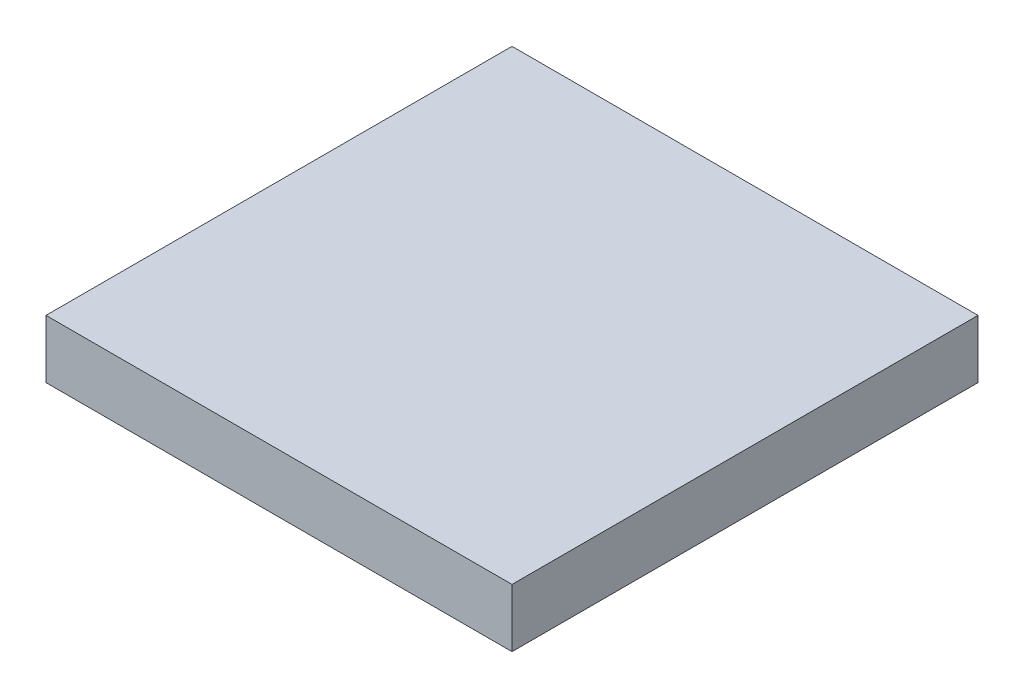
ISO-10303-21;
HEADER;
FILE_DESCRIPTION(('STEP AP214'),'2;1');
FILE_NAME('part.step','',(''),(''),'','','');
FILE_SCHEMA(('AUTOMOTIVE_DESIGN { 1 0 10303 214 1 1 1 1 }'));
ENDSEC;
DATA;
#1=APPLICATION_CONTEXT('core data for automotive mechanical design processes');
#2=APPLICATION_PROTOCOL_DEFINITION('international standard','automotive_design',2000,#1);
#3=PRODUCT_CONTEXT('',#1,'mechanical');
#4=PRODUCT('Part','Part','',(#3));
#5=PRODUCT_RELATED_PRODUCT_CATEGORY('part','',(#4));
#6=PRODUCT_DEFINITION_FORMATION('','',#4);
#7=PRODUCT_DEFINITION_CONTEXT('part definition',#1,'design');
#8=PRODUCT_DEFINITION('design','',#6,#7);
#9=PRODUCT_DEFINITION_SHAPE('','',#8);
#10=(LENGTH_UNIT() NAMED_UNIT(*) SI_UNIT(.MILLI.,.METRE.));
#11=(NAMED_UNIT(*) PLANE_ANGLE_UNIT() SI_UNIT($,.RADIAN.));
#12=(NAMED_UNIT(*) SI_UNIT($,.STERADIAN.) SOLID_ANGLE_UNIT());
#13=UNCERTAINTY_MEASURE_WITH_UNIT(LENGTH_MEASURE(1.E-05),#10,'distance_accuracy_value','');
#14=(GEOMETRIC_REPRESENTATION_CONTEXT(3) GLOBAL_UNCERTAINTY_ASSIGNED_CONTEXT((#13)) GLOBAL_UNIT_ASSIGNED_CONTEXT((#10,
#11,#12)) REPRESENTATION_CONTEXT('',''));
#15=CARTESIAN_POINT('',(0.,0.,0.));
#16=DIRECTION('',(0.,0.,1.));
#17=DIRECTION('',(1.,0.,0.));
#18=AXIS2_PLACEMENT_3D('',#15,#16,#17);
#19=CARTESIAN_POINT('',(-12.7,-15.875,12.7));
#20=DIRECTION('',(1.,0.,0.));
#21=DIRECTION('',(0.,0.,-1.));
#22=AXIS2_PLACEMENT_3D('',#19,#20,#21);
#23=PLANE('',#22);
#24=DIRECTION('',(0.,-1.,0.));
#25=VECTOR('',#24,1.);
#26=CARTESIAN_POINT('',(-12.7,-15.875,-12.7));
#27=LINE('',#26,#25);
#28=CARTESIAN_POINT('',(-12.7,-12.7,-12.7));
#29=VERTEX_POINT('',#28);
#30=CARTESIAN_POINT('',(-12.7,-15.875,-12.7));
#31=VERTEX_POINT('',#30);
#32=EDGE_CURVE('E96',#29,#31,#27,.T.);
#33=ORIENTED_EDGE('',*,*,#32,.T.);
#34=DIRECTION('',(0.,0.,-1.));
#35=VECTOR('',#34,1.);
#36=CARTESIAN_POINT('',(-12.7,-15.875,12.7));
#37=LINE('',#36,#35);
#38=CARTESIAN_POINT('',(-12.7,-15.875,12.7));
#39=VERTEX_POINT('',#38);
#40=EDGE_CURVE('E11',#39,#31,#37,.T.);
#41=ORIENTED_EDGE('',*,*,#40,.F.);
#42=DIRECTION('',(0.,-1.,0.));
#43=VECTOR('',#42,1.);
#44=CARTESIAN_POINT('',(-12.7,-15.875,12.7));
#45=LINE('',#44,#43);
#46=CARTESIAN_POINT('',(-12.7,-12.7,12.7));
#47=VERTEX_POINT('',#46);
#48=EDGE_CURVE('E84',#47,#39,#45,.T.);
#49=ORIENTED_EDGE('',*,*,#48,.F.);
#50=DIRECTION('',(0.,0.,-1.));
#51=VECTOR('',#50,1.);
#52=CARTESIAN_POINT('',(-12.7,-12.7,12.7));
#53=LINE('',#52,#51);
#54=EDGE_CURVE('E92',#47,#29,#53,.T.);
#55=ORIENTED_EDGE('',*,*,#54,.T.);
#56=EDGE_LOOP('',(#33,#41,#49,#55));
#57=FACE_BOUND('',#56,.T.);
#58=ADVANCED_FACE('F33',(#57),#23,.F.);
#59=CARTESIAN_POINT('',(12.7,-15.875,12.7));
#60=DIRECTION('',(0.,1.,0.));
#61=DIRECTION('',(-1.,0.,0.));
#62=AXIS2_PLACEMENT_3D('',#59,#60,#61);
#63=PLANE('',#62);
#64=DIRECTION('',(1.,0.,0.));
#65=VECTOR('',#64,1.);
#66=CARTESIAN_POINT('',(12.7,-15.875,-12.7));
#67=LINE('',#66,#65);
#68=CARTESIAN_POINT('',(12.7,-15.875,-12.7));
#69=VERTEX_POINT('',#68);
#70=EDGE_CURVE('E88',#31,#69,#67,.T.);
#71=ORIENTED_EDGE('',*,*,#70,.T.);
#72=DIRECTION('',(0.,0.,-1.));
#73=VECTOR('',#72,1.);
#74=CARTESIAN_POINT('',(12.7,-15.875,12.7));
#75=LINE('',#74,#73);
#76=CARTESIAN_POINT('',(12.7,-15.875,12.7));
#77=VERTEX_POINT('',#76);
#78=EDGE_CURVE('E41',#77,#69,#75,.T.);
#79=ORIENTED_EDGE('',*,*,#78,.F.);
#80=DIRECTION('',(1.,0.,0.));
#81=VECTOR('',#80,1.);
#82=CARTESIAN_POINT('',(12.7,-15.875,12.7));
#83=LINE('',#82,#81);
#84=EDGE_CURVE('E79',#39,#77,#83,.T.);
#85=ORIENTED_EDGE('',*,*,#84,.F.);
#86=ORIENTED_EDGE('',*,*,#40,.T.);
#87=EDGE_LOOP('',(#71,#79,#85,#86));
#88=FACE_BOUND('',#87,.T.);
#89=ADVANCED_FACE('F87',(#88),#63,.F.);
#90=CARTESIAN_POINT('',(12.7,-15.875,12.7));
#91=DIRECTION('',(-1.,0.,0.));
#92=DIRECTION('',(0.,0.,1.));
#93=AXIS2_PLACEMENT_3D('',#90,#91,#92);
#94=PLANE('',#93);
#95=DIRECTION('',(0.,1.,0.));
#96=VECTOR('',#95,1.);
#97=CARTESIAN_POINT('',(12.7,-15.875,-12.7));
#98=LINE('',#97,#96);
#99=CARTESIAN_POINT('',(12.7,-12.7,-12.7));
#100=VERTEX_POINT('',#99);
#101=EDGE_CURVE('E66',#69,#100,#98,.T.);
#102=ORIENTED_EDGE('',*,*,#101,.T.);
#103=DIRECTION('',(0.,0.,-1.));
#104=VECTOR('',#103,1.);
#105=CARTESIAN_POINT('',(12.7,-12.7,12.7));
#106=LINE('',#105,#104);
#107=CARTESIAN_POINT('',(12.7,-12.7,12.7));
#108=VERTEX_POINT('',#107);
#109=EDGE_CURVE('E89',#108,#100,#106,.T.);
#110=ORIENTED_EDGE('',*,*,#109,.F.);
#111=DIRECTION('',(0.,1.,0.));
#112=VECTOR('',#111,1.);
#113=CARTESIAN_POINT('',(12.7,-15.875,12.7));
#114=LINE('',#113,#112);
#115=EDGE_CURVE('E82',#77,#108,#114,.T.);
#116=ORIENTED_EDGE('',*,*,#115,.F.);
#117=ORIENTED_EDGE('',*,*,#78,.T.);
#118=EDGE_LOOP('',(#102,#110,#116,#117));
#119=FACE_BOUND('',#118,.T.);
#120=ADVANCED_FACE('F90',(#119),#94,.F.);
#121=CARTESIAN_POINT('',(12.7,-12.7,12.7));
#122=DIRECTION('',(0.,-1.,0.));
#123=DIRECTION('',(0.,0.,-1.));
#124=AXIS2_PLACEMENT_3D('',#121,#122,#123);
#125=PLANE('',#124);
#126=DIRECTION('',(-1.,0.,0.));
#127=VECTOR('',#126,1.);
#128=CARTESIAN_POINT('',(12.7,-12.7,-12.7));
#129=LINE('',#128,#127);
#130=EDGE_CURVE('E72',#100,#29,#129,.T.);
#131=ORIENTED_EDGE('',*,*,#130,.T.);
#132=ORIENTED_EDGE('',*,*,#54,.F.);
#133=DIRECTION('',(-1.,0.,0.));
#134=VECTOR('',#133,1.);
#135=CARTESIAN_POINT('',(12.7,-12.7,12.7));
#136=LINE('',#135,#134);
#137=EDGE_CURVE('E49',#108,#47,#136,.T.);
#138=ORIENTED_EDGE('',*,*,#137,.F.);
#139=ORIENTED_EDGE('',*,*,#109,.T.);
#140=EDGE_LOOP('',(#131,#132,#138,#139));
#141=FACE_BOUND('',#140,.T.);
#142=ADVANCED_FACE('F103',(#141),#125,.F.);
#143=CARTESIAN_POINT('',(0.,0.,12.7));
#144=DIRECTION('',(0.,0.,1.));
#145=DIRECTION('',(1.,0.,0.));
#146=AXIS2_PLACEMENT_3D('',#143,#144,#145);
#147=PLANE('',#146);
#148=ORIENTED_EDGE('',*,*,#48,.T.);
#149=ORIENTED_EDGE('',*,*,#84,.T.);
#150=ORIENTED_EDGE('',*,*,#115,.T.);
#151=ORIENTED_EDGE('',*,*,#137,.T.);
#152=EDGE_LOOP('',(#148,#149,#150,#151));
#153=FACE_BOUND('',#152,.T.);
#154=ADVANCED_FACE('F80',(#153),#147,.T.);
#155=CARTESIAN_POINT('',(0.,0.,-12.7));
#156=DIRECTION('',(0.,0.,1.));
#157=DIRECTION('',(1.,0.,0.));
#158=AXIS2_PLACEMENT_3D('',#155,#156,#157);
#159=PLANE('',#158);
#160=ORIENTED_EDGE('',*,*,#32,.F.);
#161=ORIENTED_EDGE('',*,*,#130,.F.);
#162=ORIENTED_EDGE('',*,*,#101,.F.);
#163=ORIENTED_EDGE('',*,*,#70,.F.);
#164=EDGE_LOOP('',(#160,#161,#162,#163));
#165=FACE_BOUND('',#164,.T.);
#166=ADVANCED_FACE('F106',(#165),#159,.F.);
#167=CLOSED_SHELL('',(#58,#89,#120,#142,#154,#166));
#168=MANIFOLD_SOLID_BREP('B2',#167);
#169=ADVANCED_BREP_SHAPE_REPRESENTATION('',(#18,#168),#14);
#170=SHAPE_DEFINITION_REPRESENTATION(#9,#169);
ENDSEC;
END-ISO-10303-21;
